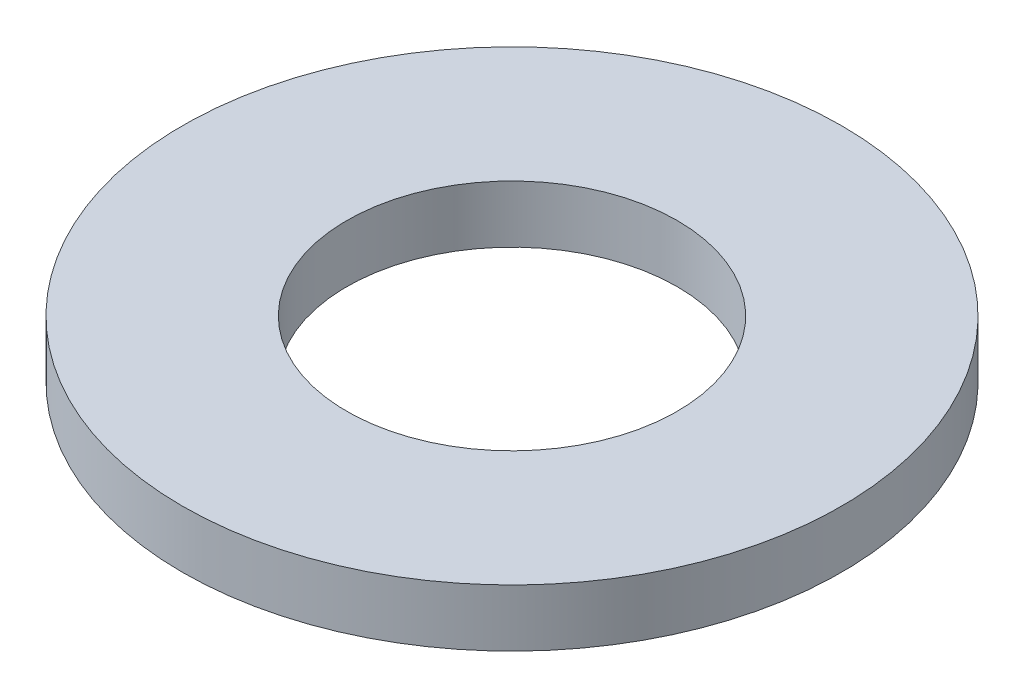
ISO-10303-21;
HEADER;
FILE_DESCRIPTION(('STEP AP214'),'2;1');
FILE_NAME('part.step','',(''),(''),'','','');
FILE_SCHEMA(('AUTOMOTIVE_DESIGN { 1 0 10303 214 1 1 1 1 }'));
ENDSEC;
DATA;
#1=APPLICATION_CONTEXT('core data for automotive mechanical design processes');
#2=APPLICATION_PROTOCOL_DEFINITION('international standard','automotive_design',2000,#1);
#3=PRODUCT_CONTEXT('',#1,'mechanical');
#4=PRODUCT('Part','Part','',(#3));
#5=PRODUCT_RELATED_PRODUCT_CATEGORY('part','',(#4));
#6=PRODUCT_DEFINITION_FORMATION('','',#4);
#7=PRODUCT_DEFINITION_CONTEXT('part definition',#1,'design');
#8=PRODUCT_DEFINITION('design','',#6,#7);
#9=PRODUCT_DEFINITION_SHAPE('','',#8);
#10=(LENGTH_UNIT() NAMED_UNIT(*) SI_UNIT(.MILLI.,.METRE.));
#11=(NAMED_UNIT(*) PLANE_ANGLE_UNIT() SI_UNIT($,.RADIAN.));
#12=(NAMED_UNIT(*) SI_UNIT($,.STERADIAN.) SOLID_ANGLE_UNIT());
#13=UNCERTAINTY_MEASURE_WITH_UNIT(LENGTH_MEASURE(1.E-05),#10,'distance_accuracy_value','');
#14=(GEOMETRIC_REPRESENTATION_CONTEXT(3) GLOBAL_UNCERTAINTY_ASSIGNED_CONTEXT((#13)) GLOBAL_UNIT_ASSIGNED_CONTEXT((#10,
#11,#12)) REPRESENTATION_CONTEXT('',''));
#15=CARTESIAN_POINT('',(0.,0.,0.));
#16=DIRECTION('',(0.,0.,1.));
#17=DIRECTION('',(1.,0.,0.));
#18=AXIS2_PLACEMENT_3D('',#15,#16,#17);
#19=CARTESIAN_POINT('',(0.,1.524,0.));
#20=DIRECTION('',(0.,1.,0.));
#21=DIRECTION('',(0.,0.,1.));
#22=AXIS2_PLACEMENT_3D('',#19,#20,#21);
#23=PLANE('',#22);
#24=CARTESIAN_POINT('',(0.,1.524,0.));
#25=DIRECTION('',(0.,1.,0.));
#26=DIRECTION('',(0.,0.,1.));
#27=AXIS2_PLACEMENT_3D('',#24,#25,#26);
#28=CIRCLE('',#27,8.763);
#29=CARTESIAN_POINT('',(0.,1.524,-8.763));
#30=VERTEX_POINT('',#29);
#31=EDGE_CURVE('E10',#30,#30,#28,.T.);
#32=ORIENTED_EDGE('',*,*,#31,.T.);
#33=EDGE_LOOP('',(#32));
#34=FACE_BOUND('',#33,.T.);
#35=CARTESIAN_POINT('',(0.,1.524,0.));
#36=DIRECTION('',(0.,1.,0.));
#37=DIRECTION('',(0.,0.,1.));
#38=AXIS2_PLACEMENT_3D('',#35,#36,#37);
#39=CIRCLE('',#38,4.3942);
#40=CARTESIAN_POINT('',(0.,1.524,-4.3942));
#41=VERTEX_POINT('',#40);
#42=EDGE_CURVE('E45',#41,#41,#39,.T.);
#43=ORIENTED_EDGE('',*,*,#42,.F.);
#44=EDGE_LOOP('',(#43));
#45=FACE_BOUND('',#44,.T.);
#46=ADVANCED_FACE('F34',(#34,#45),#23,.T.);
#47=CARTESIAN_POINT('',(0.,0.,0.));
#48=DIRECTION('',(0.,1.,0.));
#49=DIRECTION('',(0.,0.,1.));
#50=AXIS2_PLACEMENT_3D('',#47,#48,#49);
#51=PLANE('',#50);
#52=CARTESIAN_POINT('',(0.,0.,0.));
#53=DIRECTION('',(0.,1.,0.));
#54=DIRECTION('',(0.,0.,1.));
#55=AXIS2_PLACEMENT_3D('',#52,#53,#54);
#56=CIRCLE('',#55,8.763);
#57=CARTESIAN_POINT('',(0.,0.,-8.763));
#58=VERTEX_POINT('',#57);
#59=EDGE_CURVE('E38',#58,#58,#56,.T.);
#60=ORIENTED_EDGE('',*,*,#59,.F.);
#61=EDGE_LOOP('',(#60));
#62=FACE_BOUND('',#61,.T.);
#63=CARTESIAN_POINT('',(0.,0.,0.));
#64=DIRECTION('',(0.,1.,0.));
#65=DIRECTION('',(0.,0.,1.));
#66=AXIS2_PLACEMENT_3D('',#63,#64,#65);
#67=CIRCLE('',#66,4.3942);
#68=CARTESIAN_POINT('',(0.,0.,-4.3942));
#69=VERTEX_POINT('',#68);
#70=EDGE_CURVE('E47',#69,#69,#67,.T.);
#71=ORIENTED_EDGE('',*,*,#70,.T.);
#72=EDGE_LOOP('',(#71));
#73=FACE_BOUND('',#72,.T.);
#74=ADVANCED_FACE('F57',(#62,#73),#51,.F.);
#75=CARTESIAN_POINT('',(0.,1.524,0.));
#76=DIRECTION('',(0.,-1.,0.));
#77=DIRECTION('',(0.,0.,-1.));
#78=AXIS2_PLACEMENT_3D('',#75,#76,#77);
#79=CYLINDRICAL_SURFACE('',#78,8.763);
#80=CARTESIAN_POINT('',(0.,1.524,-8.763));
#81=CARTESIAN_POINT('',(0.,1.508125,-8.763));
#82=CARTESIAN_POINT('',(0.,1.49225,-8.763));
#83=CARTESIAN_POINT('',(0.,1.4605,-8.763));
#84=CARTESIAN_POINT('',(0.,1.444625,-8.763));
#85=CARTESIAN_POINT('',(0.,1.412875,-8.763));
#86=CARTESIAN_POINT('',(0.,1.397,-8.763));
#87=CARTESIAN_POINT('',(0.,1.36525,-8.763));
#88=CARTESIAN_POINT('',(0.,1.349375,-8.763));
#89=CARTESIAN_POINT('',(0.,1.317625,-8.763));
#90=CARTESIAN_POINT('',(0.,1.30175,-8.763));
#91=CARTESIAN_POINT('',(0.,1.27,-8.763));
#92=CARTESIAN_POINT('',(0.,1.254125,-8.763));
#93=CARTESIAN_POINT('',(0.,1.222375,-8.763));
#94=CARTESIAN_POINT('',(0.,1.2065,-8.763));
#95=CARTESIAN_POINT('',(0.,1.17475,-8.763));
#96=CARTESIAN_POINT('',(0.,1.158875,-8.763));
#97=CARTESIAN_POINT('',(0.,1.127125,-8.763));
#98=CARTESIAN_POINT('',(0.,1.11125,-8.763));
#99=CARTESIAN_POINT('',(0.,1.0795,-8.763));
#100=CARTESIAN_POINT('',(0.,1.063625,-8.763));
#101=CARTESIAN_POINT('',(0.,1.031875,-8.763));
#102=CARTESIAN_POINT('',(0.,1.016,-8.763));
#103=CARTESIAN_POINT('',(0.,0.98425,-8.763));
#104=CARTESIAN_POINT('',(0.,0.968375,-8.763));
#105=CARTESIAN_POINT('',(0.,0.936625,-8.763));
#106=CARTESIAN_POINT('',(0.,0.92075,-8.763));
#107=CARTESIAN_POINT('',(0.,0.889,-8.763));
#108=CARTESIAN_POINT('',(0.,0.873125,-8.763));
#109=CARTESIAN_POINT('',(0.,0.841375,-8.763));
#110=CARTESIAN_POINT('',(0.,0.8255,-8.763));
#111=CARTESIAN_POINT('',(0.,0.79375,-8.763));
#112=CARTESIAN_POINT('',(0.,0.777875,-8.763));
#113=CARTESIAN_POINT('',(0.,0.746125,-8.763));
#114=CARTESIAN_POINT('',(0.,0.73025,-8.763));
#115=CARTESIAN_POINT('',(0.,0.6985,-8.763));
#116=CARTESIAN_POINT('',(0.,0.682625,-8.763));
#117=CARTESIAN_POINT('',(0.,0.650875,-8.763));
#118=CARTESIAN_POINT('',(0.,0.635,-8.763));
#119=CARTESIAN_POINT('',(0.,0.60325,-8.763));
#120=CARTESIAN_POINT('',(0.,0.587375,-8.763));
#121=CARTESIAN_POINT('',(0.,0.555625,-8.763));
#122=CARTESIAN_POINT('',(0.,0.53975,-8.763));
#123=CARTESIAN_POINT('',(0.,0.508,-8.763));
#124=CARTESIAN_POINT('',(0.,0.492125,-8.763));
#125=CARTESIAN_POINT('',(0.,0.460375,-8.763));
#126=CARTESIAN_POINT('',(0.,0.4445,-8.763));
#127=CARTESIAN_POINT('',(0.,0.41275,-8.763));
#128=CARTESIAN_POINT('',(0.,0.396875,-8.763));
#129=CARTESIAN_POINT('',(0.,0.365125,-8.763));
#130=CARTESIAN_POINT('',(0.,0.34925,-8.763));
#131=CARTESIAN_POINT('',(0.,0.3175,-8.763));
#132=CARTESIAN_POINT('',(0.,0.301625,-8.763));
#133=CARTESIAN_POINT('',(0.,0.269875,-8.763));
#134=CARTESIAN_POINT('',(0.,0.254,-8.763));
#135=CARTESIAN_POINT('',(0.,0.22225,-8.763));
#136=CARTESIAN_POINT('',(0.,0.206375,-8.763));
#137=CARTESIAN_POINT('',(0.,0.174625,-8.763));
#138=CARTESIAN_POINT('',(0.,0.15875,-8.763));
#139=CARTESIAN_POINT('',(0.,0.127,-8.763));
#140=CARTESIAN_POINT('',(0.,0.111125,-8.763));
#141=CARTESIAN_POINT('',(0.,0.079375,-8.763));
#142=CARTESIAN_POINT('',(0.,0.0635,-8.763));
#143=CARTESIAN_POINT('',(0.,0.0317499999999999,-8.763));
#144=CARTESIAN_POINT('',(0.,0.015875,-8.763));
#145=CARTESIAN_POINT('',(0.,0.,-8.763));
#146=B_SPLINE_CURVE_WITH_KNOTS('',3,(#80,#81,#82,#83,#84,#85,#86,#87,#88,#89,#90,#91,#92,#93,
#94,#95,#96,#97,#98,#99,#100,#101,#102,#103,#104,#105,#106,#107,#108,#109,#110,#111,#112,#113,
#114,#115,#116,#117,#118,#119,#120,#121,#122,#123,#124,#125,#126,#127,#128,#129,#130,#131,#132,
#133,#134,#135,#136,#137,#138,#139,#140,#141,#142,#143,#144,#145),.UNSPECIFIED.,.F.,.F.,(4,2,2,
2,2,2,2,2,2,2,2,2,2,2,2,2,2,2,2,2,2,2,2,2,2,2,2,2,2,2,2,2,4),(0.,0.0476250000000001,
0.0952500000000001,0.142875,0.1905,0.238125,0.28575,0.333375,0.381,0.428625,0.47625,0.523875,
0.5715,0.619125,0.66675,0.714375,0.762,0.809625,0.85725,0.904875,0.9525,1.000125,1.04775,
1.095375,1.143,1.190625,1.23825,1.285875,1.3335,1.381125,1.42875,1.476375,1.524),.UNSPECIFIED.);
#147=EDGE_CURVE('BSEAM36',#30,#58,#146,.T.);
#148=ORIENTED_EDGE('',*,*,#31,.F.);
#149=ORIENTED_EDGE('',*,*,#59,.T.);
#150=ORIENTED_EDGE('',*,*,#147,.T.);
#151=ORIENTED_EDGE('',*,*,#147,.F.);
#152=EDGE_LOOP('',(#148,#150,#149,#151));
#153=FACE_BOUND('',#152,.T.);
#154=ADVANCED_FACE('F36',(#153),#79,.T.);
#155=CARTESIAN_POINT('',(0.,1.524,0.));
#156=DIRECTION('',(0.,-1.,0.));
#157=DIRECTION('',(0.,0.,-1.));
#158=AXIS2_PLACEMENT_3D('',#155,#156,#157);
#159=CYLINDRICAL_SURFACE('',#158,4.3942);
#160=CARTESIAN_POINT('',(0.,1.524,-4.3942));
#161=CARTESIAN_POINT('',(0.,1.508125,-4.3942));
#162=CARTESIAN_POINT('',(0.,1.49225,-4.3942));
#163=CARTESIAN_POINT('',(0.,1.4605,-4.3942));
#164=CARTESIAN_POINT('',(0.,1.444625,-4.3942));
#165=CARTESIAN_POINT('',(0.,1.412875,-4.3942));
#166=CARTESIAN_POINT('',(0.,1.397,-4.3942));
#167=CARTESIAN_POINT('',(0.,1.36525,-4.3942));
#168=CARTESIAN_POINT('',(0.,1.349375,-4.3942));
#169=CARTESIAN_POINT('',(0.,1.317625,-4.3942));
#170=CARTESIAN_POINT('',(0.,1.30175,-4.3942));
#171=CARTESIAN_POINT('',(0.,1.27,-4.3942));
#172=CARTESIAN_POINT('',(0.,1.254125,-4.3942));
#173=CARTESIAN_POINT('',(0.,1.222375,-4.3942));
#174=CARTESIAN_POINT('',(0.,1.2065,-4.3942));
#175=CARTESIAN_POINT('',(0.,1.17475,-4.3942));
#176=CARTESIAN_POINT('',(0.,1.158875,-4.3942));
#177=CARTESIAN_POINT('',(0.,1.127125,-4.3942));
#178=CARTESIAN_POINT('',(0.,1.11125,-4.3942));
#179=CARTESIAN_POINT('',(0.,1.0795,-4.3942));
#180=CARTESIAN_POINT('',(0.,1.063625,-4.3942));
#181=CARTESIAN_POINT('',(0.,1.031875,-4.3942));
#182=CARTESIAN_POINT('',(0.,1.016,-4.3942));
#183=CARTESIAN_POINT('',(0.,0.98425,-4.3942));
#184=CARTESIAN_POINT('',(0.,0.968375,-4.3942));
#185=CARTESIAN_POINT('',(0.,0.936625,-4.3942));
#186=CARTESIAN_POINT('',(0.,0.92075,-4.3942));
#187=CARTESIAN_POINT('',(0.,0.889,-4.3942));
#188=CARTESIAN_POINT('',(0.,0.873125,-4.3942));
#189=CARTESIAN_POINT('',(0.,0.841375,-4.3942));
#190=CARTESIAN_POINT('',(0.,0.8255,-4.3942));
#191=CARTESIAN_POINT('',(0.,0.79375,-4.3942));
#192=CARTESIAN_POINT('',(0.,0.777875,-4.3942));
#193=CARTESIAN_POINT('',(0.,0.746125,-4.3942));
#194=CARTESIAN_POINT('',(0.,0.73025,-4.3942));
#195=CARTESIAN_POINT('',(0.,0.6985,-4.3942));
#196=CARTESIAN_POINT('',(0.,0.682625,-4.3942));
#197=CARTESIAN_POINT('',(0.,0.650875,-4.3942));
#198=CARTESIAN_POINT('',(0.,0.635,-4.3942));
#199=CARTESIAN_POINT('',(0.,0.60325,-4.3942));
#200=CARTESIAN_POINT('',(0.,0.587375,-4.3942));
#201=CARTESIAN_POINT('',(0.,0.555625,-4.3942));
#202=CARTESIAN_POINT('',(0.,0.53975,-4.3942));
#203=CARTESIAN_POINT('',(0.,0.508,-4.3942));
#204=CARTESIAN_POINT('',(0.,0.492125,-4.3942));
#205=CARTESIAN_POINT('',(0.,0.460375,-4.3942));
#206=CARTESIAN_POINT('',(0.,0.4445,-4.3942));
#207=CARTESIAN_POINT('',(0.,0.41275,-4.3942));
#208=CARTESIAN_POINT('',(0.,0.396875,-4.3942));
#209=CARTESIAN_POINT('',(0.,0.365125,-4.3942));
#210=CARTESIAN_POINT('',(0.,0.34925,-4.3942));
#211=CARTESIAN_POINT('',(0.,0.3175,-4.3942));
#212=CARTESIAN_POINT('',(0.,0.301625,-4.3942));
#213=CARTESIAN_POINT('',(0.,0.269875,-4.3942));
#214=CARTESIAN_POINT('',(0.,0.254,-4.3942));
#215=CARTESIAN_POINT('',(0.,0.22225,-4.3942));
#216=CARTESIAN_POINT('',(0.,0.206375,-4.3942));
#217=CARTESIAN_POINT('',(0.,0.174625,-4.3942));
#218=CARTESIAN_POINT('',(0.,0.15875,-4.3942));
#219=CARTESIAN_POINT('',(0.,0.127,-4.3942));
#220=CARTESIAN_POINT('',(0.,0.111125,-4.3942));
#221=CARTESIAN_POINT('',(0.,0.079375,-4.3942));
#222=CARTESIAN_POINT('',(0.,0.0635,-4.3942));
#223=CARTESIAN_POINT('',(0.,0.0317499999999999,-4.3942));
#224=CARTESIAN_POINT('',(0.,0.015875,-4.3942));
#225=CARTESIAN_POINT('',(0.,0.,-4.3942));
#226=B_SPLINE_CURVE_WITH_KNOTS('',3,(#160,#161,#162,#163,#164,#165,#166,#167,#168,#169,#170,
#171,#172,#173,#174,#175,#176,#177,#178,#179,#180,#181,#182,#183,#184,#185,#186,#187,#188,#189,
#190,#191,#192,#193,#194,#195,#196,#197,#198,#199,#200,#201,#202,#203,#204,#205,#206,#207,#208,
#209,#210,#211,#212,#213,#214,#215,#216,#217,#218,#219,#220,#221,#222,#223,#224,#225),
.UNSPECIFIED.,.F.,.F.,(4,2,2,2,2,2,2,2,2,2,2,2,2,2,2,2,2,2,2,2,2,2,2,2,2,2,2,2,2,2,2,2,4),(0.,
0.0476250000000001,0.0952500000000001,0.142875,0.1905,0.238125,0.28575,0.333375,0.381,0.428625,
0.47625,0.523875,0.5715,0.619125,0.66675,0.714375,0.762,0.809625,0.85725,0.904875,0.9525,
1.000125,1.04775,1.095375,1.143,1.190625,1.23825,1.285875,1.3335,1.381125,1.42875,1.476375,
1.524),.UNSPECIFIED.);
#227=EDGE_CURVE('BSEAM53',#41,#69,#226,.T.);
#228=ORIENTED_EDGE('',*,*,#42,.T.);
#229=ORIENTED_EDGE('',*,*,#70,.F.);
#230=ORIENTED_EDGE('',*,*,#227,.T.);
#231=ORIENTED_EDGE('',*,*,#227,.F.);
#232=EDGE_LOOP('',(#228,#230,#229,#231));
#233=FACE_BOUND('',#232,.T.);
#234=ADVANCED_FACE('F53',(#233),#159,.F.);
#235=CLOSED_SHELL('',(#46,#74,#154,#234));
#236=MANIFOLD_SOLID_BREP('B2',#235);
#237=ADVANCED_BREP_SHAPE_REPRESENTATION('',(#18,#236),#14);
#238=SHAPE_DEFINITION_REPRESENTATION(#9,#237);
ENDSEC;
END-ISO-10303-21;
